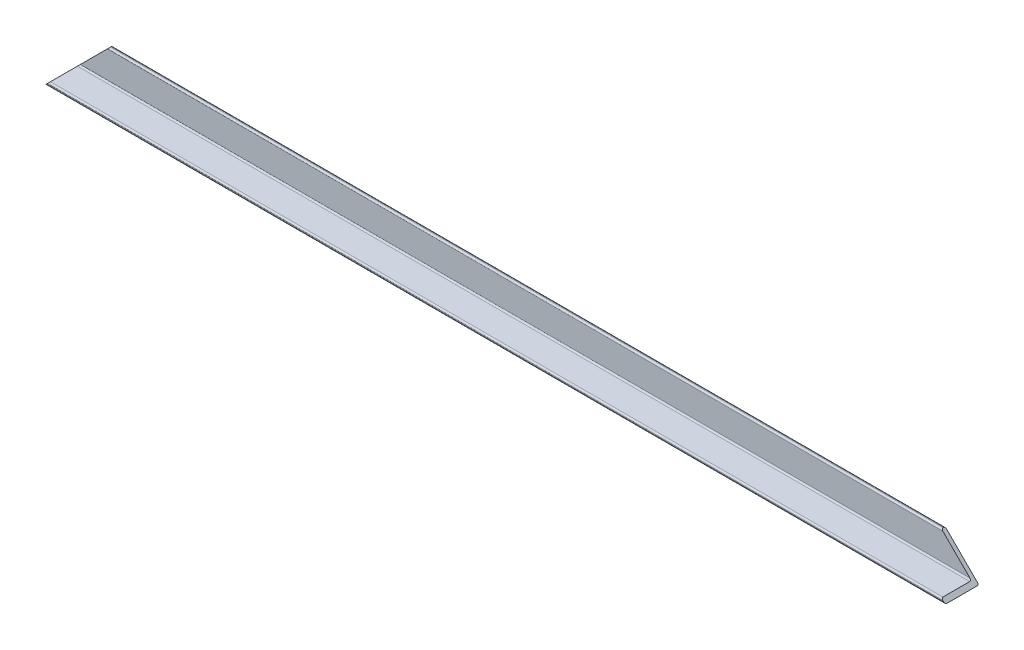
ISO-10303-21;
HEADER;
FILE_DESCRIPTION(('STEP AP214'),'2;1');
FILE_NAME('part.step','',(''),(''),'','','');
FILE_SCHEMA(('AUTOMOTIVE_DESIGN { 1 0 10303 214 1 1 1 1 }'));
ENDSEC;
DATA;
#1=APPLICATION_CONTEXT('core data for automotive mechanical design processes');
#2=APPLICATION_PROTOCOL_DEFINITION('international standard','automotive_design',2000,#1);
#3=PRODUCT_CONTEXT('',#1,'mechanical');
#4=PRODUCT('Part','Part','',(#3));
#5=PRODUCT_RELATED_PRODUCT_CATEGORY('part','',(#4));
#6=PRODUCT_DEFINITION_FORMATION('','',#4);
#7=PRODUCT_DEFINITION_CONTEXT('part definition',#1,'design');
#8=PRODUCT_DEFINITION('design','',#6,#7);
#9=PRODUCT_DEFINITION_SHAPE('','',#8);
#10=(LENGTH_UNIT() NAMED_UNIT(*) SI_UNIT(.MILLI.,.METRE.));
#11=(NAMED_UNIT(*) PLANE_ANGLE_UNIT() SI_UNIT($,.RADIAN.));
#12=(NAMED_UNIT(*) SI_UNIT($,.STERADIAN.) SOLID_ANGLE_UNIT());
#13=UNCERTAINTY_MEASURE_WITH_UNIT(LENGTH_MEASURE(1.E-05),#10,'distance_accuracy_value','');
#14=(GEOMETRIC_REPRESENTATION_CONTEXT(3) GLOBAL_UNCERTAINTY_ASSIGNED_CONTEXT((#13)) GLOBAL_UNIT_ASSIGNED_CONTEXT((#10,
#11,#12)) REPRESENTATION_CONTEXT('',''));
#15=CARTESIAN_POINT('',(0.,0.,0.));
#16=DIRECTION('',(0.,0.,1.));
#17=DIRECTION('',(1.,0.,0.));
#18=AXIS2_PLACEMENT_3D('',#15,#16,#17);
#19=CARTESIAN_POINT('',(-307.5,2.5,-11.25));
#20=DIRECTION('',(0.,0.,1.));
#21=DIRECTION('',(1.,0.,0.));
#22=AXIS2_PLACEMENT_3D('',#19,#20,#21);
#23=PLANE('',#22);
#24=DIRECTION('',(-0.707106781186544,0.707106781186551,0.));
#25=VECTOR('',#24,1.);
#26=CARTESIAN_POINT('',(-4.99999999999684,305.,-11.25));
#27=LINE('',#26,#25);
#28=CARTESIAN_POINT('',(299.,1.,-11.25));
#29=VERTEX_POINT('',#28);
#30=CARTESIAN_POINT('',(278.5,21.5,-11.25));
#31=VERTEX_POINT('',#30);
#32=EDGE_CURVE('E125',#29,#31,#27,.T.);
#33=ORIENTED_EDGE('',*,*,#32,.F.);
#34=DIRECTION('',(-1.,0.,0.));
#35=VECTOR('',#34,1.);
#36=CARTESIAN_POINT('',(-307.5,1.,-11.25));
#37=LINE('',#36,#35);
#38=CARTESIAN_POINT('',(-299.,0.999999999999998,-11.25));
#39=VERTEX_POINT('',#38);
#40=EDGE_CURVE('E137',#29,#39,#37,.T.);
#41=ORIENTED_EDGE('',*,*,#40,.T.);
#42=DIRECTION('',(-0.707106781186543,-0.707106781186552,0.));
#43=VECTOR('',#42,1.);
#44=CARTESIAN_POINT('',(-302.5,-2.49999999999994,-11.25));
#45=LINE('',#44,#43);
#46=CARTESIAN_POINT('',(-278.5,21.5,-11.25));
#47=VERTEX_POINT('',#46);
#48=EDGE_CURVE('E220',#47,#39,#45,.T.);
#49=ORIENTED_EDGE('',*,*,#48,.F.);
#50=DIRECTION('',(-1.,0.,0.));
#51=VECTOR('',#50,1.);
#52=CARTESIAN_POINT('',(277.5,21.5,-11.25));
#53=LINE('',#52,#51);
#54=EDGE_CURVE('E140',#47,#31,#53,.F.);
#55=ORIENTED_EDGE('',*,*,#54,.T.);
#56=EDGE_LOOP('',(#33,#41,#49,#55));
#57=FACE_BOUND('',#56,.T.);
#58=ADVANCED_FACE('F32',(#57),#23,.F.);
#59=CARTESIAN_POINT('',(-307.5,2.5,11.25));
#60=DIRECTION('',(0.,0.,-1.));
#61=DIRECTION('',(-1.,0.,0.));
#62=AXIS2_PLACEMENT_3D('',#59,#60,#61);
#63=PLANE('',#62);
#64=DIRECTION('',(0.707106781186543,0.707106781186552,0.));
#65=VECTOR('',#64,1.);
#66=CARTESIAN_POINT('',(-307.5,-7.5,11.25));
#67=LINE('',#66,#65);
#68=CARTESIAN_POINT('',(-299.,0.999999999999999,11.25));
#69=VERTEX_POINT('',#68);
#70=CARTESIAN_POINT('',(-298.5,1.5,11.25));
#71=VERTEX_POINT('',#70);
#72=EDGE_CURVE('E141',#69,#71,#67,.T.);
#73=ORIENTED_EDGE('',*,*,#72,.F.);
#74=DIRECTION('',(1.,0.,0.));
#75=VECTOR('',#74,1.);
#76=CARTESIAN_POINT('',(-307.5,1.,11.25));
#77=LINE('',#76,#75);
#78=CARTESIAN_POINT('',(299.,0.99999999999999,11.25));
#79=VERTEX_POINT('',#78);
#80=EDGE_CURVE('E170',#69,#79,#77,.T.);
#81=ORIENTED_EDGE('',*,*,#80,.T.);
#82=DIRECTION('',(0.707106781186544,-0.707106781186551,0.));
#83=VECTOR('',#82,1.);
#84=CARTESIAN_POINT('',(307.5,-7.5,11.25));
#85=LINE('',#84,#83);
#86=CARTESIAN_POINT('',(298.5,1.49999999999999,11.25));
#87=VERTEX_POINT('',#86);
#88=EDGE_CURVE('E233',#87,#79,#85,.T.);
#89=ORIENTED_EDGE('',*,*,#88,.F.);
#90=DIRECTION('',(1.,0.,0.));
#91=VECTOR('',#90,1.);
#92=CARTESIAN_POINT('',(-297.5,1.5,11.25));
#93=LINE('',#92,#91);
#94=EDGE_CURVE('E132',#87,#71,#93,.F.);
#95=ORIENTED_EDGE('',*,*,#94,.T.);
#96=EDGE_LOOP('',(#73,#81,#89,#95));
#97=FACE_BOUND('',#96,.T.);
#98=ADVANCED_FACE('F240',(#97),#63,.F.);
#99=CARTESIAN_POINT('',(0.,2.5,0.));
#100=DIRECTION('',(0.,1.,0.));
#101=DIRECTION('',(0.,0.,1.));
#102=AXIS2_PLACEMENT_3D('',#99,#100,#101);
#103=PLANE('',#102);
#104=DIRECTION('',(0.,0.,1.));
#105=VECTOR('',#104,1.);
#106=CARTESIAN_POINT('',(-297.5,2.5,0.));
#107=LINE('',#106,#105);
#108=CARTESIAN_POINT('',(-297.5,2.5,-7.75));
#109=VERTEX_POINT('',#108);
#110=CARTESIAN_POINT('',(-297.5,2.5,10.25));
#111=VERTEX_POINT('',#110);
#112=EDGE_CURVE('E208',#109,#111,#107,.T.);
#113=ORIENTED_EDGE('',*,*,#112,.T.);
#114=DIRECTION('',(1.,0.,0.));
#115=VECTOR('',#114,1.);
#116=CARTESIAN_POINT('',(297.5,2.5,10.25));
#117=LINE('',#116,#115);
#118=CARTESIAN_POINT('',(297.5,2.5,10.25));
#119=VERTEX_POINT('',#118);
#120=EDGE_CURVE('E174',#111,#119,#117,.T.);
#121=ORIENTED_EDGE('',*,*,#120,.T.);
#122=DIRECTION('',(0.,0.,-1.));
#123=VECTOR('',#122,1.);
#124=CARTESIAN_POINT('',(297.5,2.5,0.));
#125=LINE('',#124,#123);
#126=CARTESIAN_POINT('',(297.5,2.5,-7.75));
#127=VERTEX_POINT('',#126);
#128=EDGE_CURVE('E189',#119,#127,#125,.T.);
#129=ORIENTED_EDGE('',*,*,#128,.T.);
#130=DIRECTION('',(1.,0.,0.));
#131=VECTOR('',#130,1.);
#132=CARTESIAN_POINT('',(0.,2.5,-7.75));
#133=LINE('',#132,#131);
#134=EDGE_CURVE('E172',#127,#109,#133,.F.);
#135=ORIENTED_EDGE('',*,*,#134,.T.);
#136=EDGE_LOOP('',(#113,#121,#129,#135));
#137=FACE_BOUND('',#136,.T.);
#138=ADVANCED_FACE('F197',(#137),#103,.T.);
#139=CARTESIAN_POINT('',(0.,0.,0.));
#140=DIRECTION('',(0.,1.,0.));
#141=DIRECTION('',(0.,0.,1.));
#142=AXIS2_PLACEMENT_3D('',#139,#140,#141);
#143=PLANE('',#142);
#144=DIRECTION('',(0.,0.,1.));
#145=VECTOR('',#144,1.);
#146=CARTESIAN_POINT('',(-300.,0.,0.));
#147=LINE('',#146,#145);
#148=CARTESIAN_POINT('',(-300.,0.,-10.25));
#149=VERTEX_POINT('',#148);
#150=CARTESIAN_POINT('',(-300.,0.,10.25));
#151=VERTEX_POINT('',#150);
#152=EDGE_CURVE('E213',#149,#151,#147,.T.);
#153=ORIENTED_EDGE('',*,*,#152,.F.);
#154=DIRECTION('',(-1.,0.,0.));
#155=VECTOR('',#154,1.);
#156=CARTESIAN_POINT('',(0.,0.,-10.25));
#157=LINE('',#156,#155);
#158=CARTESIAN_POINT('',(300.,0.,-10.25));
#159=VERTEX_POINT('',#158);
#160=EDGE_CURVE('E161',#149,#159,#157,.F.);
#161=ORIENTED_EDGE('',*,*,#160,.T.);
#162=DIRECTION('',(0.,0.,-1.));
#163=VECTOR('',#162,1.);
#164=CARTESIAN_POINT('',(300.,0.,0.));
#165=LINE('',#164,#163);
#166=CARTESIAN_POINT('',(300.,0.,10.25));
#167=VERTEX_POINT('',#166);
#168=EDGE_CURVE('E128',#167,#159,#165,.T.);
#169=ORIENTED_EDGE('',*,*,#168,.F.);
#170=DIRECTION('',(1.,0.,0.));
#171=VECTOR('',#170,1.);
#172=CARTESIAN_POINT('',(0.,0.,10.25));
#173=LINE('',#172,#171);
#174=EDGE_CURVE('E159',#167,#151,#173,.F.);
#175=ORIENTED_EDGE('',*,*,#174,.T.);
#176=EDGE_LOOP('',(#153,#161,#169,#175));
#177=FACE_BOUND('',#176,.T.);
#178=ADVANCED_FACE('F248',(#177),#143,.F.);
#179=CARTESIAN_POINT('',(-307.5,22.5,-8.75));
#180=DIRECTION('',(0.,0.,-1.));
#181=DIRECTION('',(-1.,0.,0.));
#182=AXIS2_PLACEMENT_3D('',#179,#180,#181);
#183=PLANE('',#182);
#184=DIRECTION('',(0.707106781186544,-0.707106781186551,0.));
#185=VECTOR('',#184,1.);
#186=CARTESIAN_POINT('',(-14.9999999999968,315.,-8.75));
#187=LINE('',#186,#185);
#188=CARTESIAN_POINT('',(278.5,21.5,-8.75));
#189=VERTEX_POINT('',#188);
#190=CARTESIAN_POINT('',(296.5,3.49999999999995,-8.75));
#191=VERTEX_POINT('',#190);
#192=EDGE_CURVE('E191',#189,#191,#187,.T.);
#193=ORIENTED_EDGE('',*,*,#192,.F.);
#194=DIRECTION('',(1.,0.,0.));
#195=VECTOR('',#194,1.);
#196=CARTESIAN_POINT('',(-277.5,21.5,-8.75));
#197=LINE('',#196,#195);
#198=CARTESIAN_POINT('',(-278.5,21.5,-8.75));
#199=VERTEX_POINT('',#198);
#200=EDGE_CURVE('E186',#189,#199,#197,.F.);
#201=ORIENTED_EDGE('',*,*,#200,.T.);
#202=DIRECTION('',(0.707106781186543,0.707106781186552,0.));
#203=VECTOR('',#202,1.);
#204=CARTESIAN_POINT('',(-292.5,7.50000000000018,-8.75));
#205=LINE('',#204,#203);
#206=CARTESIAN_POINT('',(-296.5,3.50000000000001,-8.75));
#207=VERTEX_POINT('',#206);
#208=EDGE_CURVE('E206',#207,#199,#205,.T.);
#209=ORIENTED_EDGE('',*,*,#208,.F.);
#210=DIRECTION('',(1.,0.,0.));
#211=VECTOR('',#210,1.);
#212=CARTESIAN_POINT('',(-307.5,3.5,-8.75));
#213=LINE('',#212,#211);
#214=EDGE_CURVE('E183',#207,#191,#213,.T.);
#215=ORIENTED_EDGE('',*,*,#214,.T.);
#216=EDGE_LOOP('',(#193,#201,#209,#215));
#217=FACE_BOUND('',#216,.T.);
#218=ADVANCED_FACE('F210',(#217),#183,.F.);
#219=CARTESIAN_POINT('',(0.,22.5,0.));
#220=DIRECTION('',(0.,1.,0.));
#221=DIRECTION('',(0.,0.,1.));
#222=AXIS2_PLACEMENT_3D('',#219,#220,#221);
#223=PLANE('',#222);
#224=DIRECTION('',(0.,0.,-1.));
#225=VECTOR('',#224,1.);
#226=CARTESIAN_POINT('',(277.5,22.5,11.25));
#227=LINE('',#226,#225);
#228=CARTESIAN_POINT('',(277.5,22.5,-9.75));
#229=VERTEX_POINT('',#228);
#230=CARTESIAN_POINT('',(277.5,22.5,-10.25));
#231=VERTEX_POINT('',#230);
#232=EDGE_CURVE('E231',#229,#231,#227,.T.);
#233=ORIENTED_EDGE('',*,*,#232,.T.);
#234=DIRECTION('',(-1.,0.,0.));
#235=VECTOR('',#234,1.);
#236=CARTESIAN_POINT('',(-277.5,22.5,-10.25));
#237=LINE('',#236,#235);
#238=CARTESIAN_POINT('',(-277.5,22.5,-10.25));
#239=VERTEX_POINT('',#238);
#240=EDGE_CURVE('E180',#231,#239,#237,.T.);
#241=ORIENTED_EDGE('',*,*,#240,.T.);
#242=DIRECTION('',(0.,0.,1.));
#243=VECTOR('',#242,1.);
#244=CARTESIAN_POINT('',(-277.5,22.5,0.));
#245=LINE('',#244,#243);
#246=CARTESIAN_POINT('',(-277.5,22.5,-9.75));
#247=VERTEX_POINT('',#246);
#248=EDGE_CURVE('E149',#239,#247,#245,.T.);
#249=ORIENTED_EDGE('',*,*,#248,.T.);
#250=DIRECTION('',(1.,0.,0.));
#251=VECTOR('',#250,1.);
#252=CARTESIAN_POINT('',(277.5,22.5,-9.75));
#253=LINE('',#252,#251);
#254=EDGE_CURVE('E177',#247,#229,#253,.T.);
#255=ORIENTED_EDGE('',*,*,#254,.T.);
#256=EDGE_LOOP('',(#233,#241,#249,#255));
#257=FACE_BOUND('',#256,.T.);
#258=ADVANCED_FACE('F226',(#257),#223,.T.);
#259=CARTESIAN_POINT('',(-307.5,-7.5,11.25));
#260=DIRECTION('',(-0.707106781186552,0.707106781186543,0.));
#261=DIRECTION('',(-0.707106781186543,-0.707106781186552,0.));
#262=AXIS2_PLACEMENT_3D('',#259,#260,#261);
#263=PLANE('',#262);
#264=ORIENTED_EDGE('',*,*,#48,.T.);
#265=CARTESIAN_POINT('',(-299.,1.,-10.25));
#266=DIRECTION('',(-0.707106781186552,0.707106781186543,0.));
#267=DIRECTION('',(-0.707106781186543,-0.707106781186552,0.));
#268=AXIS2_PLACEMENT_3D('',#265,#266,#267);
#269=ELLIPSE('',#268,1.41421356237309,1.);
#270=EDGE_CURVE('E144',#39,#149,#269,.T.);
#271=ORIENTED_EDGE('',*,*,#270,.T.);
#272=ORIENTED_EDGE('',*,*,#152,.T.);
#273=CARTESIAN_POINT('',(-299.,1.,10.25));
#274=DIRECTION('',(-0.707106781186552,0.707106781186543,0.));
#275=DIRECTION('',(0.707106781186543,0.707106781186552,0.));
#276=AXIS2_PLACEMENT_3D('',#273,#274,#275);
#277=ELLIPSE('',#276,1.41421356237309,1.);
#278=EDGE_CURVE('E156',#151,#69,#277,.T.);
#279=ORIENTED_EDGE('',*,*,#278,.T.);
#280=ORIENTED_EDGE('',*,*,#72,.T.);
#281=CARTESIAN_POINT('',(-298.5,1.5,10.25));
#282=DIRECTION('',(-0.707106781186552,0.707106781186543,0.));
#283=DIRECTION('',(-0.707106781186543,-0.707106781186552,0.));
#284=AXIS2_PLACEMENT_3D('',#281,#282,#283);
#285=ELLIPSE('',#284,1.41421356237309,1.);
#286=EDGE_CURVE('E154',#71,#111,#285,.T.);
#287=ORIENTED_EDGE('',*,*,#286,.T.);
#288=ORIENTED_EDGE('',*,*,#112,.F.);
#289=CARTESIAN_POINT('',(-296.5,3.5,-7.75));
#290=DIRECTION('',(-0.707106781186552,0.707106781186543,0.));
#291=DIRECTION('',(0.707106781186543,0.707106781186552,0.));
#292=AXIS2_PLACEMENT_3D('',#289,#290,#291);
#293=ELLIPSE('',#292,1.41421356237309,1.);
#294=EDGE_CURVE('E11',#109,#207,#293,.F.);
#295=ORIENTED_EDGE('',*,*,#294,.T.);
#296=ORIENTED_EDGE('',*,*,#208,.T.);
#297=CARTESIAN_POINT('',(-278.5,21.5,-9.75));
#298=DIRECTION('',(-0.707106781186552,0.707106781186543,0.));
#299=DIRECTION('',(-0.707106781186543,-0.707106781186552,0.));
#300=AXIS2_PLACEMENT_3D('',#297,#298,#299);
#301=ELLIPSE('',#300,1.41421356237309,1.);
#302=EDGE_CURVE('E145',#199,#247,#301,.T.);
#303=ORIENTED_EDGE('',*,*,#302,.T.);
#304=ORIENTED_EDGE('',*,*,#248,.F.);
#305=CARTESIAN_POINT('',(-278.5,21.5,-10.25));
#306=DIRECTION('',(-0.707106781186552,0.707106781186543,0.));
#307=DIRECTION('',(0.707106781186543,0.707106781186552,0.));
#308=AXIS2_PLACEMENT_3D('',#305,#306,#307);
#309=ELLIPSE('',#308,1.41421356237309,1.);
#310=EDGE_CURVE('E147',#239,#47,#309,.T.);
#311=ORIENTED_EDGE('',*,*,#310,.T.);
#312=EDGE_LOOP('',(#264,#271,#272,#279,#280,#287,#288,#295,#296,#303,#304,#311));
#313=FACE_BOUND('',#312,.T.);
#314=ADVANCED_FACE('F205',(#313),#263,.T.);
#315=CARTESIAN_POINT('',(307.5,-7.5,11.25));
#316=DIRECTION('',(0.707106781186551,0.707106781186544,0.));
#317=DIRECTION('',(-0.707106781186544,0.707106781186551,0.));
#318=AXIS2_PLACEMENT_3D('',#315,#316,#317);
#319=PLANE('',#318);
#320=ORIENTED_EDGE('',*,*,#168,.T.);
#321=CARTESIAN_POINT('',(299.,1.,-10.25));
#322=DIRECTION('',(0.707106781186551,0.707106781186544,0.));
#323=DIRECTION('',(-0.707106781186544,0.707106781186551,0.));
#324=AXIS2_PLACEMENT_3D('',#321,#322,#323);
#325=ELLIPSE('',#324,1.41421356237309,1.);
#326=EDGE_CURVE('E122',#159,#29,#325,.T.);
#327=ORIENTED_EDGE('',*,*,#326,.T.);
#328=ORIENTED_EDGE('',*,*,#32,.T.);
#329=CARTESIAN_POINT('',(278.5,21.5,-10.25));
#330=DIRECTION('',(0.707106781186551,0.707106781186544,0.));
#331=DIRECTION('',(0.707106781186544,-0.707106781186551,0.));
#332=AXIS2_PLACEMENT_3D('',#329,#330,#331);
#333=ELLIPSE('',#332,1.41421356237309,1.);
#334=EDGE_CURVE('E165',#31,#231,#333,.T.);
#335=ORIENTED_EDGE('',*,*,#334,.T.);
#336=ORIENTED_EDGE('',*,*,#232,.F.);
#337=CARTESIAN_POINT('',(278.5,21.5,-9.75));
#338=DIRECTION('',(0.707106781186551,0.707106781186544,0.));
#339=DIRECTION('',(-0.707106781186544,0.707106781186551,0.));
#340=AXIS2_PLACEMENT_3D('',#337,#338,#339);
#341=ELLIPSE('',#340,1.41421356237309,1.);
#342=EDGE_CURVE('E163',#229,#189,#341,.T.);
#343=ORIENTED_EDGE('',*,*,#342,.T.);
#344=ORIENTED_EDGE('',*,*,#192,.T.);
#345=CARTESIAN_POINT('',(296.5,3.5,-7.75));
#346=DIRECTION('',(0.707106781186551,0.707106781186544,0.));
#347=DIRECTION('',(0.707106781186544,-0.707106781186551,0.));
#348=AXIS2_PLACEMENT_3D('',#345,#346,#347);
#349=ELLIPSE('',#348,1.41421356237309,1.);
#350=EDGE_CURVE('E40',#191,#127,#349,.F.);
#351=ORIENTED_EDGE('',*,*,#350,.T.);
#352=ORIENTED_EDGE('',*,*,#128,.F.);
#353=CARTESIAN_POINT('',(298.5,1.5,10.25));
#354=DIRECTION('',(0.707106781186551,0.707106781186544,0.));
#355=DIRECTION('',(-0.707106781186544,0.707106781186551,0.));
#356=AXIS2_PLACEMENT_3D('',#353,#354,#355);
#357=ELLIPSE('',#356,1.41421356237309,1.);
#358=EDGE_CURVE('E55',#119,#87,#357,.T.);
#359=ORIENTED_EDGE('',*,*,#358,.T.);
#360=ORIENTED_EDGE('',*,*,#88,.T.);
#361=CARTESIAN_POINT('',(299.,1.,10.25));
#362=DIRECTION('',(0.707106781186551,0.707106781186544,0.));
#363=DIRECTION('',(0.707106781186544,-0.707106781186551,0.));
#364=AXIS2_PLACEMENT_3D('',#361,#362,#363);
#365=ELLIPSE('',#364,1.41421356237309,1.);
#366=EDGE_CURVE('E47',#79,#167,#365,.T.);
#367=ORIENTED_EDGE('',*,*,#366,.T.);
#368=EDGE_LOOP('',(#320,#327,#328,#335,#336,#343,#344,#351,#352,#359,#360,#367));
#369=FACE_BOUND('',#368,.T.);
#370=ADVANCED_FACE('F124',(#369),#319,.T.);
#371=CARTESIAN_POINT('',(-307.5,1.,-10.25));
#372=DIRECTION('',(-1.,0.,0.));
#373=DIRECTION('',(0.,0.,1.));
#374=AXIS2_PLACEMENT_3D('',#371,#372,#373);
#375=CYLINDRICAL_SURFACE('',#374,1.);
#376=ORIENTED_EDGE('',*,*,#326,.F.);
#377=ORIENTED_EDGE('',*,*,#160,.F.);
#378=ORIENTED_EDGE('',*,*,#270,.F.);
#379=ORIENTED_EDGE('',*,*,#40,.F.);
#380=EDGE_LOOP('',(#376,#377,#378,#379));
#381=FACE_BOUND('',#380,.T.);
#382=ADVANCED_FACE('F143',(#381),#375,.T.);
#383=CARTESIAN_POINT('',(-307.5,1.,10.25));
#384=DIRECTION('',(1.,0.,0.));
#385=DIRECTION('',(0.,0.,-1.));
#386=AXIS2_PLACEMENT_3D('',#383,#384,#385);
#387=CYLINDRICAL_SURFACE('',#386,1.);
#388=ORIENTED_EDGE('',*,*,#278,.F.);
#389=ORIENTED_EDGE('',*,*,#174,.F.);
#390=ORIENTED_EDGE('',*,*,#366,.F.);
#391=ORIENTED_EDGE('',*,*,#80,.F.);
#392=EDGE_LOOP('',(#388,#389,#390,#391));
#393=FACE_BOUND('',#392,.T.);
#394=ADVANCED_FACE('F245',(#393),#387,.T.);
#395=CARTESIAN_POINT('',(0.,1.5,10.25));
#396=DIRECTION('',(-1.,0.,0.));
#397=DIRECTION('',(0.,0.,1.));
#398=AXIS2_PLACEMENT_3D('',#395,#396,#397);
#399=CYLINDRICAL_SURFACE('',#398,1.);
#400=ORIENTED_EDGE('',*,*,#286,.F.);
#401=ORIENTED_EDGE('',*,*,#94,.F.);
#402=ORIENTED_EDGE('',*,*,#358,.F.);
#403=ORIENTED_EDGE('',*,*,#120,.F.);
#404=EDGE_LOOP('',(#400,#401,#402,#403));
#405=FACE_BOUND('',#404,.T.);
#406=ADVANCED_FACE('F243',(#405),#399,.T.);
#407=CARTESIAN_POINT('',(0.,21.5,-10.25));
#408=DIRECTION('',(1.,0.,0.));
#409=DIRECTION('',(0.,0.,-1.));
#410=AXIS2_PLACEMENT_3D('',#407,#408,#409);
#411=CYLINDRICAL_SURFACE('',#410,1.);
#412=ORIENTED_EDGE('',*,*,#334,.F.);
#413=ORIENTED_EDGE('',*,*,#54,.F.);
#414=ORIENTED_EDGE('',*,*,#310,.F.);
#415=ORIENTED_EDGE('',*,*,#240,.F.);
#416=EDGE_LOOP('',(#412,#413,#414,#415));
#417=FACE_BOUND('',#416,.T.);
#418=ADVANCED_FACE('F250',(#417),#411,.T.);
#419=CARTESIAN_POINT('',(0.,21.5,-9.75));
#420=DIRECTION('',(-1.,0.,0.));
#421=DIRECTION('',(0.,0.,1.));
#422=AXIS2_PLACEMENT_3D('',#419,#420,#421);
#423=CYLINDRICAL_SURFACE('',#422,1.);
#424=ORIENTED_EDGE('',*,*,#302,.F.);
#425=ORIENTED_EDGE('',*,*,#200,.F.);
#426=ORIENTED_EDGE('',*,*,#342,.F.);
#427=ORIENTED_EDGE('',*,*,#254,.F.);
#428=EDGE_LOOP('',(#424,#425,#426,#427));
#429=FACE_BOUND('',#428,.T.);
#430=ADVANCED_FACE('F230',(#429),#423,.T.);
#431=CARTESIAN_POINT('',(-307.5,3.5,-7.75));
#432=DIRECTION('',(1.,0.,0.));
#433=DIRECTION('',(0.,0.,-1.));
#434=AXIS2_PLACEMENT_3D('',#431,#432,#433);
#435=CYLINDRICAL_SURFACE('',#434,1.);
#436=ORIENTED_EDGE('',*,*,#294,.F.);
#437=ORIENTED_EDGE('',*,*,#134,.F.);
#438=ORIENTED_EDGE('',*,*,#350,.F.);
#439=ORIENTED_EDGE('',*,*,#214,.F.);
#440=EDGE_LOOP('',(#436,#437,#438,#439));
#441=FACE_BOUND('',#440,.T.);
#442=ADVANCED_FACE('F34',(#441),#435,.F.);
#443=CLOSED_SHELL('',(#58,#98,#138,#178,#218,#258,#314,#370,#382,#394,#406,#418,#430,#442));
#444=MANIFOLD_SOLID_BREP('B2',#443);
#445=ADVANCED_BREP_SHAPE_REPRESENTATION('',(#18,#444),#14);
#446=SHAPE_DEFINITION_REPRESENTATION(#9,#445);
ENDSEC;
END-ISO-10303-21;
